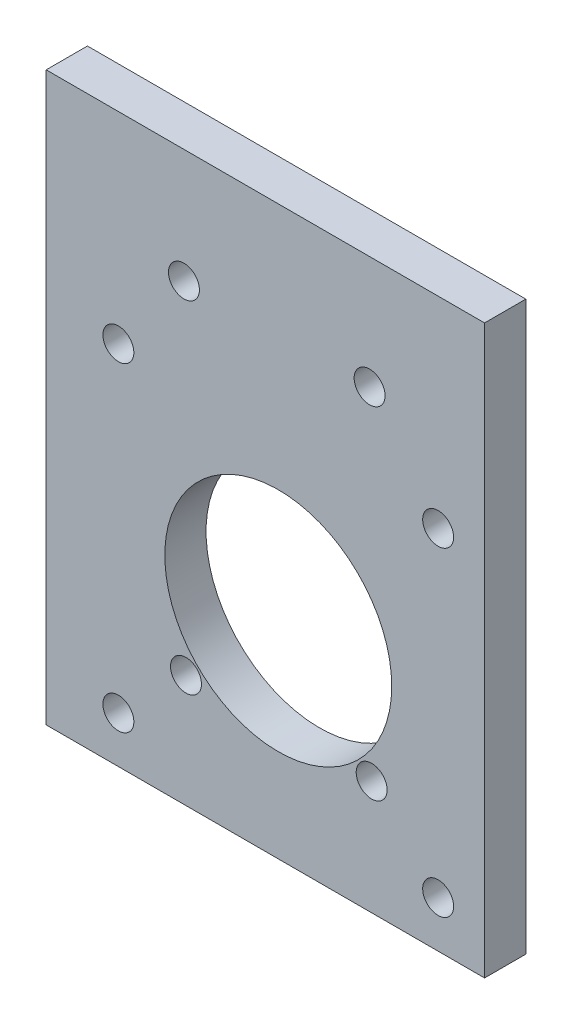
ISO-10303-21;
HEADER;
FILE_DESCRIPTION(('STEP AP214'),'2;1');
FILE_NAME('part.step','',(''),(''),'','','');
FILE_SCHEMA(('AUTOMOTIVE_DESIGN { 1 0 10303 214 1 1 1 1 }'));
ENDSEC;
DATA;
#1=APPLICATION_CONTEXT('core data for automotive mechanical design processes');
#2=APPLICATION_PROTOCOL_DEFINITION('international standard','automotive_design',2000,#1);
#3=PRODUCT_CONTEXT('',#1,'mechanical');
#4=PRODUCT('Part','Part','',(#3));
#5=PRODUCT_RELATED_PRODUCT_CATEGORY('part','',(#4));
#6=PRODUCT_DEFINITION_FORMATION('','',#4);
#7=PRODUCT_DEFINITION_CONTEXT('part definition',#1,'design');
#8=PRODUCT_DEFINITION('design','',#6,#7);
#9=PRODUCT_DEFINITION_SHAPE('','',#8);
#10=(LENGTH_UNIT() NAMED_UNIT(*) SI_UNIT(.MILLI.,.METRE.));
#11=(NAMED_UNIT(*) PLANE_ANGLE_UNIT() SI_UNIT($,.RADIAN.));
#12=(NAMED_UNIT(*) SI_UNIT($,.STERADIAN.) SOLID_ANGLE_UNIT());
#13=UNCERTAINTY_MEASURE_WITH_UNIT(LENGTH_MEASURE(1.E-05),#10,'distance_accuracy_value','');
#14=(GEOMETRIC_REPRESENTATION_CONTEXT(3) GLOBAL_UNCERTAINTY_ASSIGNED_CONTEXT((#13)) GLOBAL_UNIT_ASSIGNED_CONTEXT((#10,
#11,#12)) REPRESENTATION_CONTEXT('',''));
#15=CARTESIAN_POINT('',(0.,0.,0.));
#16=DIRECTION('',(0.,0.,1.));
#17=DIRECTION('',(1.,0.,0.));
#18=AXIS2_PLACEMENT_3D('',#15,#16,#17);
#19=CARTESIAN_POINT('',(21.25,20.,2.));
#20=DIRECTION('',(-1.,0.,0.));
#21=DIRECTION('',(0.,0.,1.));
#22=AXIS2_PLACEMENT_3D('',#19,#20,#21);
#23=PLANE('',#22);
#24=DIRECTION('',(0.,1.,0.));
#25=VECTOR('',#24,1.);
#26=CARTESIAN_POINT('',(21.25,20.,-2.));
#27=LINE('',#26,#25);
#28=CARTESIAN_POINT('',(21.25,-20.,-2.));
#29=VERTEX_POINT('',#28);
#30=CARTESIAN_POINT('',(21.25,35.,-2.));
#31=VERTEX_POINT('',#30);
#32=EDGE_CURVE('E153',#29,#31,#27,.T.);
#33=ORIENTED_EDGE('',*,*,#32,.T.);
#34=DIRECTION('',(0.,0.,-1.));
#35=VECTOR('',#34,1.);
#36=CARTESIAN_POINT('',(21.25,35.,-2.));
#37=LINE('',#36,#35);
#38=CARTESIAN_POINT('',(21.25,35.,2.));
#39=VERTEX_POINT('',#38);
#40=EDGE_CURVE('E99',#39,#31,#37,.T.);
#41=ORIENTED_EDGE('',*,*,#40,.F.);
#42=DIRECTION('',(0.,1.,0.));
#43=VECTOR('',#42,1.);
#44=CARTESIAN_POINT('',(21.25,20.,2.));
#45=LINE('',#44,#43);
#46=CARTESIAN_POINT('',(21.25,-20.,2.));
#47=VERTEX_POINT('',#46);
#48=EDGE_CURVE('E89',#47,#39,#45,.T.);
#49=ORIENTED_EDGE('',*,*,#48,.F.);
#50=DIRECTION('',(0.,0.,-1.));
#51=VECTOR('',#50,1.);
#52=CARTESIAN_POINT('',(21.25,-20.,2.));
#53=LINE('',#52,#51);
#54=EDGE_CURVE('E49',#47,#29,#53,.T.);
#55=ORIENTED_EDGE('',*,*,#54,.T.);
#56=EDGE_LOOP('',(#33,#41,#49,#55));
#57=FACE_BOUND('',#56,.T.);
#58=ADVANCED_FACE('F39',(#57),#23,.F.);
#59=CARTESIAN_POINT('',(-21.25,20.,2.));
#60=DIRECTION('',(1.,0.,0.));
#61=DIRECTION('',(0.,1.,0.));
#62=AXIS2_PLACEMENT_3D('',#59,#60,#61);
#63=PLANE('',#62);
#64=DIRECTION('',(0.,-1.,0.));
#65=VECTOR('',#64,1.);
#66=CARTESIAN_POINT('',(-21.25,20.,-2.));
#67=LINE('',#66,#65);
#68=CARTESIAN_POINT('',(-21.25,35.,-2.));
#69=VERTEX_POINT('',#68);
#70=CARTESIAN_POINT('',(-21.25,-20.,-2.));
#71=VERTEX_POINT('',#70);
#72=EDGE_CURVE('E69',#69,#71,#67,.T.);
#73=ORIENTED_EDGE('',*,*,#72,.T.);
#74=DIRECTION('',(0.,0.,-1.));
#75=VECTOR('',#74,1.);
#76=CARTESIAN_POINT('',(-21.25,-20.,2.));
#77=LINE('',#76,#75);
#78=CARTESIAN_POINT('',(-21.25,-20.,2.));
#79=VERTEX_POINT('',#78);
#80=EDGE_CURVE('E11',#79,#71,#77,.T.);
#81=ORIENTED_EDGE('',*,*,#80,.F.);
#82=DIRECTION('',(0.,-1.,0.));
#83=VECTOR('',#82,1.);
#84=CARTESIAN_POINT('',(-21.25,20.,2.));
#85=LINE('',#84,#83);
#86=CARTESIAN_POINT('',(-21.25,35.,2.));
#87=VERTEX_POINT('',#86);
#88=EDGE_CURVE('E83',#87,#79,#85,.T.);
#89=ORIENTED_EDGE('',*,*,#88,.F.);
#90=DIRECTION('',(0.,0.,1.));
#91=VECTOR('',#90,1.);
#92=CARTESIAN_POINT('',(-21.25,35.,-2.));
#93=LINE('',#92,#91);
#94=EDGE_CURVE('E87',#69,#87,#93,.T.);
#95=ORIENTED_EDGE('',*,*,#94,.F.);
#96=EDGE_LOOP('',(#73,#81,#89,#95));
#97=FACE_BOUND('',#96,.T.);
#98=ADVANCED_FACE('F85',(#97),#63,.F.);
#99=CARTESIAN_POINT('',(-21.25,-20.,2.));
#100=DIRECTION('',(0.,1.,0.));
#101=DIRECTION('',(0.,0.,1.));
#102=AXIS2_PLACEMENT_3D('',#99,#100,#101);
#103=PLANE('',#102);
#104=DIRECTION('',(1.,0.,0.));
#105=VECTOR('',#104,1.);
#106=CARTESIAN_POINT('',(-21.25,-20.,-2.));
#107=LINE('',#106,#105);
#108=EDGE_CURVE('E158',#71,#29,#107,.T.);
#109=ORIENTED_EDGE('',*,*,#108,.T.);
#110=ORIENTED_EDGE('',*,*,#54,.F.);
#111=DIRECTION('',(1.,0.,0.));
#112=VECTOR('',#111,1.);
#113=CARTESIAN_POINT('',(-21.25,-20.,2.));
#114=LINE('',#113,#112);
#115=EDGE_CURVE('E58',#79,#47,#114,.T.);
#116=ORIENTED_EDGE('',*,*,#115,.F.);
#117=ORIENTED_EDGE('',*,*,#80,.T.);
#118=EDGE_LOOP('',(#109,#110,#116,#117));
#119=FACE_BOUND('',#118,.T.);
#120=ADVANCED_FACE('F207',(#119),#103,.F.);
#121=CARTESIAN_POINT('',(0.,0.,2.));
#122=DIRECTION('',(0.,0.,1.));
#123=DIRECTION('',(1.,0.,0.));
#124=AXIS2_PLACEMENT_3D('',#121,#122,#123);
#125=PLANE('',#124);
#126=CARTESIAN_POINT('',(-7.69577181131252,-9.05390339576949,2.));
#127=DIRECTION('',(0.,0.,1.));
#128=DIRECTION('',(1.,0.,0.));
#129=AXIS2_PLACEMENT_3D('',#126,#127,#128);
#130=CIRCLE('',#129,1.5);
#131=CARTESIAN_POINT('',(-6.19577181131252,-9.05390339576949,2.));
#132=VERTEX_POINT('',#131);
#133=EDGE_CURVE('E371',#132,#132,#130,.T.);
#134=ORIENTED_EDGE('',*,*,#133,.F.);
#135=EDGE_LOOP('',(#134));
#136=FACE_BOUND('',#135,.T.);
#137=CARTESIAN_POINT('',(10.3039033957695,-8.94577181131251,2.));
#138=DIRECTION('',(0.,0.,1.));
#139=DIRECTION('',(1.,0.,0.));
#140=AXIS2_PLACEMENT_3D('',#137,#138,#139);
#141=CIRCLE('',#140,1.5);
#142=CARTESIAN_POINT('',(11.8039033957695,-8.94577181131251,2.));
#143=VERTEX_POINT('',#142);
#144=EDGE_CURVE('E367',#143,#143,#141,.T.);
#145=ORIENTED_EDGE('',*,*,#144,.F.);
#146=EDGE_LOOP('',(#145));
#147=FACE_BOUND('',#146,.T.);
#148=CARTESIAN_POINT('',(10.1056621575984,24.0536327350045,2.));
#149=DIRECTION('',(0.,0.,1.));
#150=DIRECTION('',(1.,0.,0.));
#151=AXIS2_PLACEMENT_3D('',#148,#149,#150);
#152=CIRCLE('',#151,1.5);
#153=CARTESIAN_POINT('',(11.6056621575984,24.0536327350045,2.));
#154=VERTEX_POINT('',#153);
#155=EDGE_CURVE('E364',#154,#154,#152,.T.);
#156=ORIENTED_EDGE('',*,*,#155,.F.);
#157=EDGE_LOOP('',(#156));
#158=FACE_BOUND('',#157,.T.);
#159=CARTESIAN_POINT('',(-7.89401304948366,23.9455011505475,2.));
#160=DIRECTION('',(0.,0.,1.));
#161=DIRECTION('',(1.,0.,0.));
#162=AXIS2_PLACEMENT_3D('',#159,#160,#161);
#163=CIRCLE('',#162,1.5);
#164=CARTESIAN_POINT('',(-6.39401304948366,23.9455011505475,2.));
#165=VERTEX_POINT('',#164);
#166=EDGE_CURVE('E109',#165,#165,#163,.T.);
#167=ORIENTED_EDGE('',*,*,#166,.F.);
#168=EDGE_LOOP('',(#167));
#169=FACE_BOUND('',#168,.T.);
#170=CARTESIAN_POINT('',(1.25,0.,2.));
#171=DIRECTION('',(0.,0.,1.));
#172=DIRECTION('',(1.,0.,0.));
#173=AXIS2_PLACEMENT_3D('',#170,#171,#172);
#174=CIRCLE('',#173,11.);
#175=CARTESIAN_POINT('',(12.25,0.,2.));
#176=VERTEX_POINT('',#175);
#177=EDGE_CURVE('E116',#176,#176,#174,.T.);
#178=ORIENTED_EDGE('',*,*,#177,.F.);
#179=EDGE_LOOP('',(#178));
#180=FACE_BOUND('',#179,.T.);
#181=CARTESIAN_POINT('',(16.75,-15.5,2.));
#182=DIRECTION('',(0.,0.,-1.));
#183=DIRECTION('',(-1.,0.,0.));
#184=AXIS2_PLACEMENT_3D('',#181,#182,#183);
#185=CIRCLE('',#184,1.5);
#186=CARTESIAN_POINT('',(15.25,-15.5,2.));
#187=VERTEX_POINT('',#186);
#188=EDGE_CURVE('E142',#187,#187,#185,.T.);
#189=ORIENTED_EDGE('',*,*,#188,.T.);
#190=EDGE_LOOP('',(#189));
#191=FACE_BOUND('',#190,.T.);
#192=CARTESIAN_POINT('',(-14.25,-15.5,2.));
#193=DIRECTION('',(0.,0.,-1.));
#194=DIRECTION('',(-1.,0.,0.));
#195=AXIS2_PLACEMENT_3D('',#192,#193,#194);
#196=CIRCLE('',#195,1.5);
#197=CARTESIAN_POINT('',(-15.75,-15.5,2.));
#198=VERTEX_POINT('',#197);
#199=EDGE_CURVE('E134',#198,#198,#196,.T.);
#200=ORIENTED_EDGE('',*,*,#199,.T.);
#201=EDGE_LOOP('',(#200));
#202=FACE_BOUND('',#201,.T.);
#203=CARTESIAN_POINT('',(-14.25,15.5,2.));
#204=DIRECTION('',(0.,0.,-1.));
#205=DIRECTION('',(-1.,0.,0.));
#206=AXIS2_PLACEMENT_3D('',#203,#204,#205);
#207=CIRCLE('',#206,1.5);
#208=CARTESIAN_POINT('',(-15.75,15.5,2.));
#209=VERTEX_POINT('',#208);
#210=EDGE_CURVE('E125',#209,#209,#207,.T.);
#211=ORIENTED_EDGE('',*,*,#210,.T.);
#212=EDGE_LOOP('',(#211));
#213=FACE_BOUND('',#212,.T.);
#214=CARTESIAN_POINT('',(16.75,15.5,2.));
#215=DIRECTION('',(0.,0.,-1.));
#216=DIRECTION('',(-1.,0.,0.));
#217=AXIS2_PLACEMENT_3D('',#214,#215,#216);
#218=CIRCLE('',#217,1.5);
#219=CARTESIAN_POINT('',(15.25,15.5,2.));
#220=VERTEX_POINT('',#219);
#221=EDGE_CURVE('E149',#220,#220,#218,.T.);
#222=ORIENTED_EDGE('',*,*,#221,.T.);
#223=EDGE_LOOP('',(#222));
#224=FACE_BOUND('',#223,.T.);
#225=ORIENTED_EDGE('',*,*,#48,.T.);
#226=DIRECTION('',(1.,0.,0.));
#227=VECTOR('',#226,1.);
#228=CARTESIAN_POINT('',(-21.25,35.,2.));
#229=LINE('',#228,#227);
#230=EDGE_CURVE('E92',#87,#39,#229,.T.);
#231=ORIENTED_EDGE('',*,*,#230,.F.);
#232=ORIENTED_EDGE('',*,*,#88,.T.);
#233=ORIENTED_EDGE('',*,*,#115,.T.);
#234=EDGE_LOOP('',(#225,#231,#232,#233));
#235=FACE_BOUND('',#234,.T.);
#236=ADVANCED_FACE('F93',(#136,#147,#158,#169,#180,#191,#202,#213,#224,#235),#125,.T.);
#237=CARTESIAN_POINT('',(0.,0.,-2.));
#238=DIRECTION('',(0.,0.,1.));
#239=DIRECTION('',(1.,0.,0.));
#240=AXIS2_PLACEMENT_3D('',#237,#238,#239);
#241=PLANE('',#240);
#242=CARTESIAN_POINT('',(-7.69577181131252,-9.05390339576949,-2.));
#243=DIRECTION('',(0.,0.,1.));
#244=DIRECTION('',(1.,0.,0.));
#245=AXIS2_PLACEMENT_3D('',#242,#243,#244);
#246=CIRCLE('',#245,1.5);
#247=CARTESIAN_POINT('',(-6.19577181131252,-9.05390339576949,-2.));
#248=VERTEX_POINT('',#247);
#249=EDGE_CURVE('E42',#248,#248,#246,.T.);
#250=ORIENTED_EDGE('',*,*,#249,.T.);
#251=EDGE_LOOP('',(#250));
#252=FACE_BOUND('',#251,.T.);
#253=CARTESIAN_POINT('',(10.3039033957695,-8.94577181131251,-2.));
#254=DIRECTION('',(0.,0.,1.));
#255=DIRECTION('',(1.,0.,0.));
#256=AXIS2_PLACEMENT_3D('',#253,#254,#255);
#257=CIRCLE('',#256,1.5);
#258=CARTESIAN_POINT('',(11.8039033957695,-8.94577181131251,-2.));
#259=VERTEX_POINT('',#258);
#260=EDGE_CURVE('E107',#259,#259,#257,.T.);
#261=ORIENTED_EDGE('',*,*,#260,.T.);
#262=EDGE_LOOP('',(#261));
#263=FACE_BOUND('',#262,.T.);
#264=CARTESIAN_POINT('',(10.1056621575984,24.0536327350045,-2.));
#265=DIRECTION('',(0.,0.,1.));
#266=DIRECTION('',(1.,0.,0.));
#267=AXIS2_PLACEMENT_3D('',#264,#265,#266);
#268=CIRCLE('',#267,1.5);
#269=CARTESIAN_POINT('',(11.6056621575984,24.0536327350045,-2.));
#270=VERTEX_POINT('',#269);
#271=EDGE_CURVE('E175',#270,#270,#268,.T.);
#272=ORIENTED_EDGE('',*,*,#271,.T.);
#273=EDGE_LOOP('',(#272));
#274=FACE_BOUND('',#273,.T.);
#275=CARTESIAN_POINT('',(-7.89401304948366,23.9455011505475,-2.));
#276=DIRECTION('',(0.,0.,1.));
#277=DIRECTION('',(1.,0.,0.));
#278=AXIS2_PLACEMENT_3D('',#275,#276,#277);
#279=CIRCLE('',#278,1.5);
#280=CARTESIAN_POINT('',(-6.39401304948366,23.9455011505475,-2.));
#281=VERTEX_POINT('',#280);
#282=EDGE_CURVE('E171',#281,#281,#279,.T.);
#283=ORIENTED_EDGE('',*,*,#282,.T.);
#284=EDGE_LOOP('',(#283));
#285=FACE_BOUND('',#284,.T.);
#286=CARTESIAN_POINT('',(1.25,0.,-2.));
#287=DIRECTION('',(0.,0.,1.));
#288=DIRECTION('',(1.,0.,0.));
#289=AXIS2_PLACEMENT_3D('',#286,#287,#288);
#290=CIRCLE('',#289,11.);
#291=CARTESIAN_POINT('',(12.25,0.,-2.));
#292=VERTEX_POINT('',#291);
#293=EDGE_CURVE('E117',#292,#292,#290,.T.);
#294=ORIENTED_EDGE('',*,*,#293,.T.);
#295=EDGE_LOOP('',(#294));
#296=FACE_BOUND('',#295,.T.);
#297=CARTESIAN_POINT('',(16.75,-15.5,-2.));
#298=DIRECTION('',(0.,0.,-1.));
#299=DIRECTION('',(-1.,0.,0.));
#300=AXIS2_PLACEMENT_3D('',#297,#298,#299);
#301=CIRCLE('',#300,1.5);
#302=CARTESIAN_POINT('',(15.25,-15.5,-2.));
#303=VERTEX_POINT('',#302);
#304=EDGE_CURVE('E121',#303,#303,#301,.T.);
#305=ORIENTED_EDGE('',*,*,#304,.F.);
#306=EDGE_LOOP('',(#305));
#307=FACE_BOUND('',#306,.T.);
#308=CARTESIAN_POINT('',(-14.25,-15.5,-2.));
#309=DIRECTION('',(0.,0.,-1.));
#310=DIRECTION('',(-1.,0.,0.));
#311=AXIS2_PLACEMENT_3D('',#308,#309,#310);
#312=CIRCLE('',#311,1.5);
#313=CARTESIAN_POINT('',(-15.75,-15.5,-2.));
#314=VERTEX_POINT('',#313);
#315=EDGE_CURVE('E138',#314,#314,#312,.T.);
#316=ORIENTED_EDGE('',*,*,#315,.F.);
#317=EDGE_LOOP('',(#316));
#318=FACE_BOUND('',#317,.T.);
#319=CARTESIAN_POINT('',(-14.25,15.5,-2.));
#320=DIRECTION('',(0.,0.,-1.));
#321=DIRECTION('',(-1.,0.,0.));
#322=AXIS2_PLACEMENT_3D('',#319,#320,#321);
#323=CIRCLE('',#322,1.5);
#324=CARTESIAN_POINT('',(-15.75,15.5,-2.));
#325=VERTEX_POINT('',#324);
#326=EDGE_CURVE('E130',#325,#325,#323,.T.);
#327=ORIENTED_EDGE('',*,*,#326,.F.);
#328=EDGE_LOOP('',(#327));
#329=FACE_BOUND('',#328,.T.);
#330=CARTESIAN_POINT('',(16.75,15.5,-2.));
#331=DIRECTION('',(0.,0.,-1.));
#332=DIRECTION('',(-1.,0.,0.));
#333=AXIS2_PLACEMENT_3D('',#330,#331,#332);
#334=CIRCLE('',#333,1.5);
#335=CARTESIAN_POINT('',(15.25,15.5,-2.));
#336=VERTEX_POINT('',#335);
#337=EDGE_CURVE('E129',#336,#336,#334,.T.);
#338=ORIENTED_EDGE('',*,*,#337,.F.);
#339=EDGE_LOOP('',(#338));
#340=FACE_BOUND('',#339,.T.);
#341=ORIENTED_EDGE('',*,*,#32,.F.);
#342=ORIENTED_EDGE('',*,*,#108,.F.);
#343=ORIENTED_EDGE('',*,*,#72,.F.);
#344=DIRECTION('',(-1.,0.,0.));
#345=VECTOR('',#344,1.);
#346=CARTESIAN_POINT('',(-21.25,35.,-2.));
#347=LINE('',#346,#345);
#348=EDGE_CURVE('E102',#31,#69,#347,.T.);
#349=ORIENTED_EDGE('',*,*,#348,.F.);
#350=EDGE_LOOP('',(#341,#342,#343,#349));
#351=FACE_BOUND('',#350,.T.);
#352=ADVANCED_FACE('F182',(#252,#263,#274,#285,#296,#307,#318,#329,#340,#351),#241,.F.);
#353=CARTESIAN_POINT('',(16.75,15.5,2.));
#354=DIRECTION('',(0.,0.,-1.));
#355=DIRECTION('',(-1.,0.,0.));
#356=AXIS2_PLACEMENT_3D('',#353,#354,#355);
#357=CYLINDRICAL_SURFACE('',#356,1.5);
#358=ORIENTED_EDGE('',*,*,#221,.F.);
#359=EDGE_LOOP('',(#358));
#360=FACE_BOUND('',#359,.T.);
#361=ORIENTED_EDGE('',*,*,#337,.T.);
#362=EDGE_LOOP('',(#361));
#363=FACE_BOUND('',#362,.T.);
#364=ADVANCED_FACE('F210',(#360,#363),#357,.F.);
#365=CARTESIAN_POINT('',(-14.25,15.5,2.));
#366=DIRECTION('',(0.,0.,-1.));
#367=DIRECTION('',(-1.,0.,0.));
#368=AXIS2_PLACEMENT_3D('',#365,#366,#367);
#369=CYLINDRICAL_SURFACE('',#368,1.5);
#370=ORIENTED_EDGE('',*,*,#210,.F.);
#371=EDGE_LOOP('',(#370));
#372=FACE_BOUND('',#371,.T.);
#373=ORIENTED_EDGE('',*,*,#326,.T.);
#374=EDGE_LOOP('',(#373));
#375=FACE_BOUND('',#374,.T.);
#376=ADVANCED_FACE('F217',(#372,#375),#369,.F.);
#377=CARTESIAN_POINT('',(-14.25,-15.5,2.));
#378=DIRECTION('',(0.,0.,-1.));
#379=DIRECTION('',(-1.,0.,0.));
#380=AXIS2_PLACEMENT_3D('',#377,#378,#379);
#381=CYLINDRICAL_SURFACE('',#380,1.5);
#382=ORIENTED_EDGE('',*,*,#199,.F.);
#383=EDGE_LOOP('',(#382));
#384=FACE_BOUND('',#383,.T.);
#385=ORIENTED_EDGE('',*,*,#315,.T.);
#386=EDGE_LOOP('',(#385));
#387=FACE_BOUND('',#386,.T.);
#388=ADVANCED_FACE('F244',(#384,#387),#381,.F.);
#389=CARTESIAN_POINT('',(16.75,-15.5,2.));
#390=DIRECTION('',(0.,0.,-1.));
#391=DIRECTION('',(-1.,0.,0.));
#392=AXIS2_PLACEMENT_3D('',#389,#390,#391);
#393=CYLINDRICAL_SURFACE('',#392,1.5);
#394=ORIENTED_EDGE('',*,*,#188,.F.);
#395=EDGE_LOOP('',(#394));
#396=FACE_BOUND('',#395,.T.);
#397=ORIENTED_EDGE('',*,*,#304,.T.);
#398=EDGE_LOOP('',(#397));
#399=FACE_BOUND('',#398,.T.);
#400=ADVANCED_FACE('F254',(#396,#399),#393,.F.);
#401=CARTESIAN_POINT('',(1.25,0.,-2.));
#402=DIRECTION('',(0.,0.,1.));
#403=DIRECTION('',(1.,0.,0.));
#404=AXIS2_PLACEMENT_3D('',#401,#402,#403);
#405=CYLINDRICAL_SURFACE('',#404,11.);
#406=ORIENTED_EDGE('',*,*,#293,.F.);
#407=EDGE_LOOP('',(#406));
#408=FACE_BOUND('',#407,.T.);
#409=ORIENTED_EDGE('',*,*,#177,.T.);
#410=EDGE_LOOP('',(#409));
#411=FACE_BOUND('',#410,.T.);
#412=ADVANCED_FACE('F264',(#408,#411),#405,.F.);
#413=CARTESIAN_POINT('',(0.,35.,0.));
#414=DIRECTION('',(0.,1.,0.));
#415=DIRECTION('',(0.,0.,1.));
#416=AXIS2_PLACEMENT_3D('',#413,#414,#415);
#417=PLANE('',#416);
#418=ORIENTED_EDGE('',*,*,#94,.T.);
#419=ORIENTED_EDGE('',*,*,#230,.T.);
#420=ORIENTED_EDGE('',*,*,#40,.T.);
#421=ORIENTED_EDGE('',*,*,#348,.T.);
#422=EDGE_LOOP('',(#418,#419,#420,#421));
#423=FACE_BOUND('',#422,.T.);
#424=ADVANCED_FACE('F101',(#423),#417,.T.);
#425=CARTESIAN_POINT('',(-7.89401304948366,23.9455011505475,-8.));
#426=DIRECTION('',(0.,0.,1.));
#427=DIRECTION('',(1.,0.,0.));
#428=AXIS2_PLACEMENT_3D('',#425,#426,#427);
#429=CYLINDRICAL_SURFACE('',#428,1.5);
#430=ORIENTED_EDGE('',*,*,#166,.T.);
#431=EDGE_LOOP('',(#430));
#432=FACE_BOUND('',#431,.T.);
#433=ORIENTED_EDGE('',*,*,#282,.F.);
#434=EDGE_LOOP('',(#433));
#435=FACE_BOUND('',#434,.T.);
#436=ADVANCED_FACE('F197',(#432,#435),#429,.F.);
#437=CARTESIAN_POINT('',(10.1056621575984,24.0536327350045,-8.));
#438=DIRECTION('',(0.,0.,1.));
#439=DIRECTION('',(1.,0.,0.));
#440=AXIS2_PLACEMENT_3D('',#437,#438,#439);
#441=CYLINDRICAL_SURFACE('',#440,1.5);
#442=ORIENTED_EDGE('',*,*,#155,.T.);
#443=EDGE_LOOP('',(#442));
#444=FACE_BOUND('',#443,.T.);
#445=ORIENTED_EDGE('',*,*,#271,.F.);
#446=EDGE_LOOP('',(#445));
#447=FACE_BOUND('',#446,.T.);
#448=ADVANCED_FACE('F188',(#444,#447),#441,.F.);
#449=CARTESIAN_POINT('',(10.3039033957695,-8.94577181131251,-8.));
#450=DIRECTION('',(0.,0.,1.));
#451=DIRECTION('',(1.,0.,0.));
#452=AXIS2_PLACEMENT_3D('',#449,#450,#451);
#453=CYLINDRICAL_SURFACE('',#452,1.5);
#454=ORIENTED_EDGE('',*,*,#144,.T.);
#455=EDGE_LOOP('',(#454));
#456=FACE_BOUND('',#455,.T.);
#457=ORIENTED_EDGE('',*,*,#260,.F.);
#458=EDGE_LOOP('',(#457));
#459=FACE_BOUND('',#458,.T.);
#460=ADVANCED_FACE('F185',(#456,#459),#453,.F.);
#461=CARTESIAN_POINT('',(-7.69577181131252,-9.05390339576949,-8.));
#462=DIRECTION('',(0.,0.,1.));
#463=DIRECTION('',(1.,0.,0.));
#464=AXIS2_PLACEMENT_3D('',#461,#462,#463);
#465=CYLINDRICAL_SURFACE('',#464,1.5);
#466=ORIENTED_EDGE('',*,*,#133,.T.);
#467=EDGE_LOOP('',(#466));
#468=FACE_BOUND('',#467,.T.);
#469=ORIENTED_EDGE('',*,*,#249,.F.);
#470=EDGE_LOOP('',(#469));
#471=FACE_BOUND('',#470,.T.);
#472=ADVANCED_FACE('F187',(#468,#471),#465,.F.);
#473=CLOSED_SHELL('',(#58,#98,#120,#236,#352,#364,#376,#388,#400,#412,#424,#436,#448,#460,#472));
#474=MANIFOLD_SOLID_BREP('B2',#473);
#475=ADVANCED_BREP_SHAPE_REPRESENTATION('',(#18,#474),#14);
#476=SHAPE_DEFINITION_REPRESENTATION(#9,#475);
ENDSEC;
END-ISO-10303-21;
